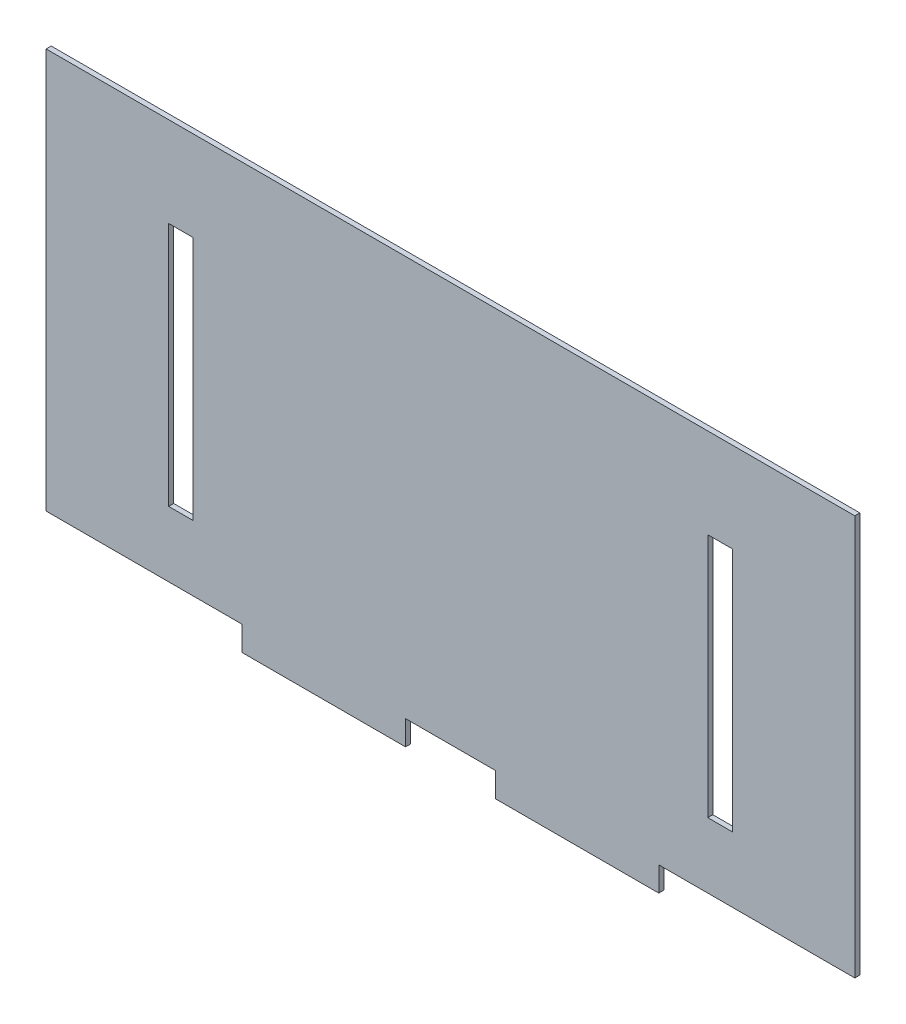
ISO-10303-21;
HEADER;
FILE_DESCRIPTION(('STEP AP214'),'2;1');
FILE_NAME('part.step','',(''),(''),'','','');
FILE_SCHEMA(('AUTOMOTIVE_DESIGN { 1 0 10303 214 1 1 1 1 }'));
ENDSEC;
DATA;
#1=APPLICATION_CONTEXT('core data for automotive mechanical design processes');
#2=APPLICATION_PROTOCOL_DEFINITION('international standard','automotive_design',2000,#1);
#3=PRODUCT_CONTEXT('',#1,'mechanical');
#4=PRODUCT('Part','Part','',(#3));
#5=PRODUCT_RELATED_PRODUCT_CATEGORY('part','',(#4));
#6=PRODUCT_DEFINITION_FORMATION('','',#4);
#7=PRODUCT_DEFINITION_CONTEXT('part definition',#1,'design');
#8=PRODUCT_DEFINITION('design','',#6,#7);
#9=PRODUCT_DEFINITION_SHAPE('','',#8);
#10=(LENGTH_UNIT() NAMED_UNIT(*) SI_UNIT(.MILLI.,.METRE.));
#11=(NAMED_UNIT(*) PLANE_ANGLE_UNIT() SI_UNIT($,.RADIAN.));
#12=(NAMED_UNIT(*) SI_UNIT($,.STERADIAN.) SOLID_ANGLE_UNIT());
#13=UNCERTAINTY_MEASURE_WITH_UNIT(LENGTH_MEASURE(1.E-05),#10,'distance_accuracy_value','');
#14=(GEOMETRIC_REPRESENTATION_CONTEXT(3) GLOBAL_UNCERTAINTY_ASSIGNED_CONTEXT((#13)) GLOBAL_UNIT_ASSIGNED_CONTEXT((#10,
#11,#12)) REPRESENTATION_CONTEXT('',''));
#15=CARTESIAN_POINT('',(0.,0.,0.));
#16=DIRECTION('',(0.,0.,1.));
#17=DIRECTION('',(1.,0.,0.));
#18=AXIS2_PLACEMENT_3D('',#15,#16,#17);
#19=CARTESIAN_POINT('',(0.,0.,3.));
#20=DIRECTION('',(0.,0.,-1.));
#21=DIRECTION('',(-1.,0.,0.));
#22=AXIS2_PLACEMENT_3D('',#19,#20,#21);
#23=PLANE('',#22);
#24=DIRECTION('',(0.,-1.,0.));
#25=VECTOR('',#24,1.);
#26=CARTESIAN_POINT('',(402.597909756795,1127.38171994128,3.));
#27=LINE('',#26,#25);
#28=CARTESIAN_POINT('',(402.597909756795,1272.58049934139,3.));
#29=VERTEX_POINT('',#28);
#30=CARTESIAN_POINT('',(402.597909756795,1127.38171994128,3.));
#31=VERTEX_POINT('',#30);
#32=EDGE_CURVE('E206',#29,#31,#27,.T.);
#33=ORIENTED_EDGE('',*,*,#32,.F.);
#34=DIRECTION('',(-1.,0.,0.));
#35=VECTOR('',#34,1.);
#36=CARTESIAN_POINT('',(402.597909756795,1272.58049934139,3.));
#37=LINE('',#36,#35);
#38=CARTESIAN_POINT('',(417.122789951493,1272.58049934139,3.));
#39=VERTEX_POINT('',#38);
#40=EDGE_CURVE('E214',#39,#29,#37,.T.);
#41=ORIENTED_EDGE('',*,*,#40,.F.);
#42=DIRECTION('',(0.,1.,0.));
#43=VECTOR('',#42,1.);
#44=CARTESIAN_POINT('',(417.122789951493,1272.58049934139,3.));
#45=LINE('',#44,#43);
#46=CARTESIAN_POINT('',(417.122789951493,1127.38171994128,3.));
#47=VERTEX_POINT('',#46);
#48=EDGE_CURVE('E211',#47,#39,#45,.T.);
#49=ORIENTED_EDGE('',*,*,#48,.F.);
#50=DIRECTION('',(1.,0.,0.));
#51=VECTOR('',#50,1.);
#52=CARTESIAN_POINT('',(417.122789951493,1127.38171994128,3.));
#53=LINE('',#52,#51);
#54=EDGE_CURVE('E208',#31,#47,#53,.T.);
#55=ORIENTED_EDGE('',*,*,#54,.F.);
#56=EDGE_LOOP('',(#33,#41,#49,#55));
#57=FACE_BOUND('',#56,.T.);
#58=DIRECTION('',(0.,1.,0.));
#59=VECTOR('',#58,1.);
#60=CARTESIAN_POINT('',(489.722179651545,1325.81949598202,3.));
#61=LINE('',#60,#59);
#62=CARTESIAN_POINT('',(489.722179651545,1088.66927091358,3.));
#63=VERTEX_POINT('',#62);
#64=CARTESIAN_POINT('',(489.722179651545,1325.81949598202,3.));
#65=VERTEX_POINT('',#64);
#66=EDGE_CURVE('E237',#63,#65,#61,.T.);
#67=ORIENTED_EDGE('',*,*,#66,.T.);
#68=DIRECTION('',(-1.,0.,0.));
#69=VECTOR('',#68,1.);
#70=CARTESIAN_POINT('',(10.5628727947426,1325.81949598202,3.));
#71=LINE('',#70,#69);
#72=CARTESIAN_POINT('',(10.5628727947426,1325.81949598202,3.));
#73=VERTEX_POINT('',#72);
#74=EDGE_CURVE('E240',#65,#73,#71,.T.);
#75=ORIENTED_EDGE('',*,*,#74,.T.);
#76=DIRECTION('',(0.,-1.,0.));
#77=VECTOR('',#76,1.);
#78=CARTESIAN_POINT('',(10.5628727947426,1088.66927091358,3.));
#79=LINE('',#78,#77);
#80=CARTESIAN_POINT('',(10.5628727947426,1088.66927091358,3.));
#81=VERTEX_POINT('',#80);
#82=EDGE_CURVE('E243',#73,#81,#79,.T.);
#83=ORIENTED_EDGE('',*,*,#82,.T.);
#84=DIRECTION('',(1.,0.,0.));
#85=VECTOR('',#84,1.);
#86=CARTESIAN_POINT('',(126.721896314826,1088.66927091358,3.));
#87=LINE('',#86,#85);
#88=CARTESIAN_POINT('',(126.721896314826,1088.66927091358,3.));
#89=VERTEX_POINT('',#88);
#90=EDGE_CURVE('E245',#81,#89,#87,.T.);
#91=ORIENTED_EDGE('',*,*,#90,.T.);
#92=DIRECTION('',(0.,-1.,0.));
#93=VECTOR('',#92,1.);
#94=CARTESIAN_POINT('',(126.721896314826,1074.14939297357,3.));
#95=LINE('',#94,#93);
#96=CARTESIAN_POINT('',(126.721896314826,1074.14939297357,3.));
#97=VERTEX_POINT('',#96);
#98=EDGE_CURVE('E247',#89,#97,#95,.T.);
#99=ORIENTED_EDGE('',*,*,#98,.T.);
#100=DIRECTION('',(1.,0.,0.));
#101=VECTOR('',#100,1.);
#102=CARTESIAN_POINT('',(223.522194193715,1074.14939297357,3.));
#103=LINE('',#102,#101);
#104=CARTESIAN_POINT('',(223.522194193715,1074.14939297357,3.));
#105=VERTEX_POINT('',#104);
#106=EDGE_CURVE('E249',#97,#105,#103,.T.);
#107=ORIENTED_EDGE('',*,*,#106,.T.);
#108=DIRECTION('',(0.,1.,0.));
#109=VECTOR('',#108,1.);
#110=CARTESIAN_POINT('',(223.522194193715,1088.66927091358,3.));
#111=LINE('',#110,#109);
#112=CARTESIAN_POINT('',(223.522194193715,1088.66927091358,3.));
#113=VERTEX_POINT('',#112);
#114=EDGE_CURVE('E251',#105,#113,#111,.T.);
#115=ORIENTED_EDGE('',*,*,#114,.T.);
#116=DIRECTION('',(1.,0.,0.));
#117=VECTOR('',#116,1.);
#118=CARTESIAN_POINT('',(276.759523416114,1088.66927091358,3.));
#119=LINE('',#118,#117);
#120=CARTESIAN_POINT('',(276.759523416114,1088.66927091358,3.));
#121=VERTEX_POINT('',#120);
#122=EDGE_CURVE('E253',#113,#121,#119,.T.);
#123=ORIENTED_EDGE('',*,*,#122,.T.);
#124=DIRECTION('',(0.,-1.,0.));
#125=VECTOR('',#124,1.);
#126=CARTESIAN_POINT('',(276.759523416114,1074.14939297357,3.));
#127=LINE('',#126,#125);
#128=CARTESIAN_POINT('',(276.759523416114,1074.14939297357,3.));
#129=VERTEX_POINT('',#128);
#130=EDGE_CURVE('E255',#121,#129,#127,.T.);
#131=ORIENTED_EDGE('',*,*,#130,.T.);
#132=DIRECTION('',(1.,0.,0.));
#133=VECTOR('',#132,1.);
#134=CARTESIAN_POINT('',(373.559821295004,1074.14939297357,3.));
#135=LINE('',#134,#133);
#136=CARTESIAN_POINT('',(373.559821295004,1074.14939297357,3.));
#137=VERTEX_POINT('',#136);
#138=EDGE_CURVE('E257',#129,#137,#135,.T.);
#139=ORIENTED_EDGE('',*,*,#138,.T.);
#140=DIRECTION('',(0.,1.,0.));
#141=VECTOR('',#140,1.);
#142=CARTESIAN_POINT('',(373.559821295004,1088.66927091358,3.));
#143=LINE('',#142,#141);
#144=CARTESIAN_POINT('',(373.559821295004,1088.66927091358,3.));
#145=VERTEX_POINT('',#144);
#146=EDGE_CURVE('E259',#137,#145,#143,.T.);
#147=ORIENTED_EDGE('',*,*,#146,.T.);
#148=DIRECTION('',(1.,0.,0.));
#149=VECTOR('',#148,1.);
#150=CARTESIAN_POINT('',(489.722179651545,1088.66927091358,3.));
#151=LINE('',#150,#149);
#152=EDGE_CURVE('E261',#145,#63,#151,.T.);
#153=ORIENTED_EDGE('',*,*,#152,.T.);
#154=EDGE_LOOP('',(#67,#75,#83,#91,#99,#107,#115,#123,#131,#139,#147,#153));
#155=FACE_BOUND('',#154,.T.);
#156=DIRECTION('',(0.,-1.,0.));
#157=VECTOR('',#156,1.);
#158=CARTESIAN_POINT('',(83.1605950765656,1127.38171994128,3.));
#159=LINE('',#158,#157);
#160=CARTESIAN_POINT('',(83.1605950765656,1272.58049934139,3.));
#161=VERTEX_POINT('',#160);
#162=CARTESIAN_POINT('',(83.1605950765656,1127.38171994128,3.));
#163=VERTEX_POINT('',#162);
#164=EDGE_CURVE('E170',#161,#163,#159,.T.);
#165=ORIENTED_EDGE('',*,*,#164,.F.);
#166=DIRECTION('',(-1.,0.,0.));
#167=VECTOR('',#166,1.);
#168=CARTESIAN_POINT('',(83.1605950765656,1272.58049934139,3.));
#169=LINE('',#168,#167);
#170=CARTESIAN_POINT('',(97.6838078530344,1272.58049934139,3.));
#171=VERTEX_POINT('',#170);
#172=EDGE_CURVE('E192',#171,#161,#169,.T.);
#173=ORIENTED_EDGE('',*,*,#172,.F.);
#174=DIRECTION('',(0.,1.,0.));
#175=VECTOR('',#174,1.);
#176=CARTESIAN_POINT('',(97.6838078530344,1272.58049934139,3.));
#177=LINE('',#176,#175);
#178=CARTESIAN_POINT('',(97.6838078530344,1127.38171994128,3.));
#179=VERTEX_POINT('',#178);
#180=EDGE_CURVE('E190',#179,#171,#177,.T.);
#181=ORIENTED_EDGE('',*,*,#180,.F.);
#182=DIRECTION('',(1.,0.,0.));
#183=VECTOR('',#182,1.);
#184=CARTESIAN_POINT('',(97.6838078530344,1127.38171994128,3.));
#185=LINE('',#184,#183);
#186=EDGE_CURVE('E178',#163,#179,#185,.T.);
#187=ORIENTED_EDGE('',*,*,#186,.F.);
#188=EDGE_LOOP('',(#165,#173,#181,#187));
#189=FACE_BOUND('',#188,.T.);
#190=ADVANCED_FACE('F33',(#57,#155,#189),#23,.F.);
#191=CARTESIAN_POINT('',(0.,0.,0.));
#192=DIRECTION('',(0.,0.,-1.));
#193=DIRECTION('',(-1.,0.,0.));
#194=AXIS2_PLACEMENT_3D('',#191,#192,#193);
#195=PLANE('',#194);
#196=DIRECTION('',(0.,1.,0.));
#197=VECTOR('',#196,1.);
#198=CARTESIAN_POINT('',(489.722179651545,1325.81949598202,0.));
#199=LINE('',#198,#197);
#200=CARTESIAN_POINT('',(489.722179651545,1088.66927091358,0.));
#201=VERTEX_POINT('',#200);
#202=CARTESIAN_POINT('',(489.722179651545,1325.81949598202,0.));
#203=VERTEX_POINT('',#202);
#204=EDGE_CURVE('E236',#201,#203,#199,.T.);
#205=ORIENTED_EDGE('',*,*,#204,.F.);
#206=DIRECTION('',(1.,0.,0.));
#207=VECTOR('',#206,1.);
#208=CARTESIAN_POINT('',(489.722179651545,1088.66927091358,0.));
#209=LINE('',#208,#207);
#210=CARTESIAN_POINT('',(373.559821295004,1088.66927091358,0.));
#211=VERTEX_POINT('',#210);
#212=EDGE_CURVE('E241',#211,#201,#209,.T.);
#213=ORIENTED_EDGE('',*,*,#212,.F.);
#214=DIRECTION('',(0.,1.,0.));
#215=VECTOR('',#214,1.);
#216=CARTESIAN_POINT('',(373.559821295004,1088.66927091358,0.));
#217=LINE('',#216,#215);
#218=CARTESIAN_POINT('',(373.559821295004,1074.14939297357,0.));
#219=VERTEX_POINT('',#218);
#220=EDGE_CURVE('E284',#219,#211,#217,.T.);
#221=ORIENTED_EDGE('',*,*,#220,.F.);
#222=DIRECTION('',(1.,0.,0.));
#223=VECTOR('',#222,1.);
#224=CARTESIAN_POINT('',(373.559821295004,1074.14939297357,0.));
#225=LINE('',#224,#223);
#226=CARTESIAN_POINT('',(276.759523416114,1074.14939297357,0.));
#227=VERTEX_POINT('',#226);
#228=EDGE_CURVE('E282',#227,#219,#225,.T.);
#229=ORIENTED_EDGE('',*,*,#228,.F.);
#230=DIRECTION('',(0.,-1.,0.));
#231=VECTOR('',#230,1.);
#232=CARTESIAN_POINT('',(276.759523416114,1074.14939297357,0.));
#233=LINE('',#232,#231);
#234=CARTESIAN_POINT('',(276.759523416114,1088.66927091358,0.));
#235=VERTEX_POINT('',#234);
#236=EDGE_CURVE('E280',#235,#227,#233,.T.);
#237=ORIENTED_EDGE('',*,*,#236,.F.);
#238=DIRECTION('',(1.,0.,0.));
#239=VECTOR('',#238,1.);
#240=CARTESIAN_POINT('',(276.759523416114,1088.66927091358,0.));
#241=LINE('',#240,#239);
#242=CARTESIAN_POINT('',(223.522194193715,1088.66927091358,0.));
#243=VERTEX_POINT('',#242);
#244=EDGE_CURVE('E278',#243,#235,#241,.T.);
#245=ORIENTED_EDGE('',*,*,#244,.F.);
#246=DIRECTION('',(0.,1.,0.));
#247=VECTOR('',#246,1.);
#248=CARTESIAN_POINT('',(223.522194193715,1088.66927091358,0.));
#249=LINE('',#248,#247);
#250=CARTESIAN_POINT('',(223.522194193715,1074.14939297357,0.));
#251=VERTEX_POINT('',#250);
#252=EDGE_CURVE('E276',#251,#243,#249,.T.);
#253=ORIENTED_EDGE('',*,*,#252,.F.);
#254=DIRECTION('',(1.,0.,0.));
#255=VECTOR('',#254,1.);
#256=CARTESIAN_POINT('',(223.522194193715,1074.14939297357,0.));
#257=LINE('',#256,#255);
#258=CARTESIAN_POINT('',(126.721896314826,1074.14939297357,0.));
#259=VERTEX_POINT('',#258);
#260=EDGE_CURVE('E274',#259,#251,#257,.T.);
#261=ORIENTED_EDGE('',*,*,#260,.F.);
#262=DIRECTION('',(0.,-1.,0.));
#263=VECTOR('',#262,1.);
#264=CARTESIAN_POINT('',(126.721896314826,1074.14939297357,0.));
#265=LINE('',#264,#263);
#266=CARTESIAN_POINT('',(126.721896314826,1088.66927091358,0.));
#267=VERTEX_POINT('',#266);
#268=EDGE_CURVE('E272',#267,#259,#265,.T.);
#269=ORIENTED_EDGE('',*,*,#268,.F.);
#270=DIRECTION('',(1.,0.,0.));
#271=VECTOR('',#270,1.);
#272=CARTESIAN_POINT('',(126.721896314826,1088.66927091358,0.));
#273=LINE('',#272,#271);
#274=CARTESIAN_POINT('',(10.5628727947426,1088.66927091358,0.));
#275=VERTEX_POINT('',#274);
#276=EDGE_CURVE('E270',#275,#267,#273,.T.);
#277=ORIENTED_EDGE('',*,*,#276,.F.);
#278=DIRECTION('',(0.,-1.,0.));
#279=VECTOR('',#278,1.);
#280=CARTESIAN_POINT('',(10.5628727947426,1088.66927091358,0.));
#281=LINE('',#280,#279);
#282=CARTESIAN_POINT('',(10.5628727947426,1325.81949598202,0.));
#283=VERTEX_POINT('',#282);
#284=EDGE_CURVE('E268',#283,#275,#281,.T.);
#285=ORIENTED_EDGE('',*,*,#284,.F.);
#286=DIRECTION('',(-1.,0.,0.));
#287=VECTOR('',#286,1.);
#288=CARTESIAN_POINT('',(10.5628727947426,1325.81949598202,0.));
#289=LINE('',#288,#287);
#290=EDGE_CURVE('E266',#203,#283,#289,.T.);
#291=ORIENTED_EDGE('',*,*,#290,.F.);
#292=EDGE_LOOP('',(#205,#213,#221,#229,#237,#245,#253,#261,#269,#277,#285,#291));
#293=FACE_BOUND('',#292,.T.);
#294=DIRECTION('',(-1.,0.,0.));
#295=VECTOR('',#294,1.);
#296=CARTESIAN_POINT('',(402.597909756795,1272.58049934139,0.));
#297=LINE('',#296,#295);
#298=CARTESIAN_POINT('',(417.122789951493,1272.58049934139,0.));
#299=VERTEX_POINT('',#298);
#300=CARTESIAN_POINT('',(402.597909756795,1272.58049934139,0.));
#301=VERTEX_POINT('',#300);
#302=EDGE_CURVE('E209',#299,#301,#297,.T.);
#303=ORIENTED_EDGE('',*,*,#302,.T.);
#304=DIRECTION('',(0.,-1.,0.));
#305=VECTOR('',#304,1.);
#306=CARTESIAN_POINT('',(402.597909756795,1127.38171994128,0.));
#307=LINE('',#306,#305);
#308=CARTESIAN_POINT('',(402.597909756795,1127.38171994128,0.));
#309=VERTEX_POINT('',#308);
#310=EDGE_CURVE('E186',#301,#309,#307,.T.);
#311=ORIENTED_EDGE('',*,*,#310,.T.);
#312=DIRECTION('',(1.,0.,0.));
#313=VECTOR('',#312,1.);
#314=CARTESIAN_POINT('',(417.122789951493,1127.38171994128,0.));
#315=LINE('',#314,#313);
#316=CARTESIAN_POINT('',(417.122789951493,1127.38171994128,0.));
#317=VERTEX_POINT('',#316);
#318=EDGE_CURVE('E219',#309,#317,#315,.T.);
#319=ORIENTED_EDGE('',*,*,#318,.T.);
#320=DIRECTION('',(0.,1.,0.));
#321=VECTOR('',#320,1.);
#322=CARTESIAN_POINT('',(417.122789951493,1272.58049934139,0.));
#323=LINE('',#322,#321);
#324=EDGE_CURVE('E222',#317,#299,#323,.T.);
#325=ORIENTED_EDGE('',*,*,#324,.T.);
#326=EDGE_LOOP('',(#303,#311,#319,#325));
#327=FACE_BOUND('',#326,.T.);
#328=DIRECTION('',(-1.,0.,0.));
#329=VECTOR('',#328,1.);
#330=CARTESIAN_POINT('',(83.1605950765656,1272.58049934139,0.));
#331=LINE('',#330,#329);
#332=CARTESIAN_POINT('',(97.6838078530344,1272.58049934139,0.));
#333=VERTEX_POINT('',#332);
#334=CARTESIAN_POINT('',(83.1605950765656,1272.58049934139,0.));
#335=VERTEX_POINT('',#334);
#336=EDGE_CURVE('E179',#333,#335,#331,.T.);
#337=ORIENTED_EDGE('',*,*,#336,.T.);
#338=DIRECTION('',(0.,-1.,0.));
#339=VECTOR('',#338,1.);
#340=CARTESIAN_POINT('',(83.1605950765656,1127.38171994128,0.));
#341=LINE('',#340,#339);
#342=CARTESIAN_POINT('',(83.1605950765656,1127.38171994128,0.));
#343=VERTEX_POINT('',#342);
#344=EDGE_CURVE('E56',#335,#343,#341,.T.);
#345=ORIENTED_EDGE('',*,*,#344,.T.);
#346=DIRECTION('',(1.,0.,0.));
#347=VECTOR('',#346,1.);
#348=CARTESIAN_POINT('',(97.6838078530344,1127.38171994128,0.));
#349=LINE('',#348,#347);
#350=CARTESIAN_POINT('',(97.6838078530344,1127.38171994128,0.));
#351=VERTEX_POINT('',#350);
#352=EDGE_CURVE('E185',#343,#351,#349,.T.);
#353=ORIENTED_EDGE('',*,*,#352,.T.);
#354=DIRECTION('',(0.,1.,0.));
#355=VECTOR('',#354,1.);
#356=CARTESIAN_POINT('',(97.6838078530344,1272.58049934139,0.));
#357=LINE('',#356,#355);
#358=EDGE_CURVE('E198',#351,#333,#357,.T.);
#359=ORIENTED_EDGE('',*,*,#358,.T.);
#360=EDGE_LOOP('',(#337,#345,#353,#359));
#361=FACE_BOUND('',#360,.T.);
#362=ADVANCED_FACE('F326',(#293,#327,#361),#195,.T.);
#363=CARTESIAN_POINT('',(489.722179651545,1325.81949598202,3.));
#364=DIRECTION('',(-1.,0.,0.));
#365=DIRECTION('',(0.,0.,1.));
#366=AXIS2_PLACEMENT_3D('',#363,#364,#365);
#367=PLANE('',#366);
#368=ORIENTED_EDGE('',*,*,#204,.T.);
#369=DIRECTION('',(0.,0.,-1.));
#370=VECTOR('',#369,1.);
#371=CARTESIAN_POINT('',(489.722179651545,1325.81949598202,3.));
#372=LINE('',#371,#370);
#373=EDGE_CURVE('E11',#65,#203,#372,.T.);
#374=ORIENTED_EDGE('',*,*,#373,.F.);
#375=ORIENTED_EDGE('',*,*,#66,.F.);
#376=DIRECTION('',(0.,0.,-1.));
#377=VECTOR('',#376,1.);
#378=CARTESIAN_POINT('',(489.722179651545,1088.66927091358,3.));
#379=LINE('',#378,#377);
#380=EDGE_CURVE('E263',#63,#201,#379,.T.);
#381=ORIENTED_EDGE('',*,*,#380,.T.);
#382=EDGE_LOOP('',(#368,#374,#375,#381));
#383=FACE_BOUND('',#382,.T.);
#384=ADVANCED_FACE('F35',(#383),#367,.F.);
#385=CARTESIAN_POINT('',(10.5628727947426,1325.81949598202,3.));
#386=DIRECTION('',(0.,-1.,0.));
#387=DIRECTION('',(0.,0.,-1.));
#388=AXIS2_PLACEMENT_3D('',#385,#386,#387);
#389=PLANE('',#388);
#390=ORIENTED_EDGE('',*,*,#290,.T.);
#391=DIRECTION('',(0.,0.,-1.));
#392=VECTOR('',#391,1.);
#393=CARTESIAN_POINT('',(10.5628727947426,1325.81949598202,3.));
#394=LINE('',#393,#392);
#395=EDGE_CURVE('E41',#73,#283,#394,.T.);
#396=ORIENTED_EDGE('',*,*,#395,.F.);
#397=ORIENTED_EDGE('',*,*,#74,.F.);
#398=ORIENTED_EDGE('',*,*,#373,.T.);
#399=EDGE_LOOP('',(#390,#396,#397,#398));
#400=FACE_BOUND('',#399,.T.);
#401=ADVANCED_FACE('F343',(#400),#389,.F.);
#402=CARTESIAN_POINT('',(10.5628727947426,1088.66927091358,3.));
#403=DIRECTION('',(1.,0.,0.));
#404=DIRECTION('',(0.,0.,-1.));
#405=AXIS2_PLACEMENT_3D('',#402,#403,#404);
#406=PLANE('',#405);
#407=ORIENTED_EDGE('',*,*,#284,.T.);
#408=DIRECTION('',(0.,0.,-1.));
#409=VECTOR('',#408,1.);
#410=CARTESIAN_POINT('',(10.5628727947426,1088.66927091358,3.));
#411=LINE('',#410,#409);
#412=EDGE_CURVE('E313',#81,#275,#411,.T.);
#413=ORIENTED_EDGE('',*,*,#412,.F.);
#414=ORIENTED_EDGE('',*,*,#82,.F.);
#415=ORIENTED_EDGE('',*,*,#395,.T.);
#416=EDGE_LOOP('',(#407,#413,#414,#415));
#417=FACE_BOUND('',#416,.T.);
#418=ADVANCED_FACE('F320',(#417),#406,.F.);
#419=CARTESIAN_POINT('',(126.721896314826,1088.66927091358,3.));
#420=DIRECTION('',(0.,1.,0.));
#421=DIRECTION('',(0.,0.,1.));
#422=AXIS2_PLACEMENT_3D('',#419,#420,#421);
#423=PLANE('',#422);
#424=ORIENTED_EDGE('',*,*,#276,.T.);
#425=DIRECTION('',(0.,0.,-1.));
#426=VECTOR('',#425,1.);
#427=CARTESIAN_POINT('',(126.721896314826,1088.66927091358,3.));
#428=LINE('',#427,#426);
#429=EDGE_CURVE('E310',#89,#267,#428,.T.);
#430=ORIENTED_EDGE('',*,*,#429,.F.);
#431=ORIENTED_EDGE('',*,*,#90,.F.);
#432=ORIENTED_EDGE('',*,*,#412,.T.);
#433=EDGE_LOOP('',(#424,#430,#431,#432));
#434=FACE_BOUND('',#433,.T.);
#435=ADVANCED_FACE('F332',(#434),#423,.F.);
#436=CARTESIAN_POINT('',(126.721896314826,1074.14939297357,3.));
#437=DIRECTION('',(1.,0.,0.));
#438=DIRECTION('',(0.,0.,-1.));
#439=AXIS2_PLACEMENT_3D('',#436,#437,#438);
#440=PLANE('',#439);
#441=ORIENTED_EDGE('',*,*,#268,.T.);
#442=DIRECTION('',(0.,0.,-1.));
#443=VECTOR('',#442,1.);
#444=CARTESIAN_POINT('',(126.721896314826,1074.14939297357,3.));
#445=LINE('',#444,#443);
#446=EDGE_CURVE('E307',#97,#259,#445,.T.);
#447=ORIENTED_EDGE('',*,*,#446,.F.);
#448=ORIENTED_EDGE('',*,*,#98,.F.);
#449=ORIENTED_EDGE('',*,*,#429,.T.);
#450=EDGE_LOOP('',(#441,#447,#448,#449));
#451=FACE_BOUND('',#450,.T.);
#452=ADVANCED_FACE('F336',(#451),#440,.F.);
#453=CARTESIAN_POINT('',(223.522194193715,1074.14939297357,3.));
#454=DIRECTION('',(0.,1.,0.));
#455=DIRECTION('',(0.,0.,1.));
#456=AXIS2_PLACEMENT_3D('',#453,#454,#455);
#457=PLANE('',#456);
#458=ORIENTED_EDGE('',*,*,#260,.T.);
#459=DIRECTION('',(0.,0.,-1.));
#460=VECTOR('',#459,1.);
#461=CARTESIAN_POINT('',(223.522194193715,1074.14939297357,3.));
#462=LINE('',#461,#460);
#463=EDGE_CURVE('E304',#105,#251,#462,.T.);
#464=ORIENTED_EDGE('',*,*,#463,.F.);
#465=ORIENTED_EDGE('',*,*,#106,.F.);
#466=ORIENTED_EDGE('',*,*,#446,.T.);
#467=EDGE_LOOP('',(#458,#464,#465,#466));
#468=FACE_BOUND('',#467,.T.);
#469=ADVANCED_FACE('F376',(#468),#457,.F.);
#470=CARTESIAN_POINT('',(223.522194193715,1088.66927091358,3.));
#471=DIRECTION('',(-1.,0.,0.));
#472=DIRECTION('',(0.,0.,1.));
#473=AXIS2_PLACEMENT_3D('',#470,#471,#472);
#474=PLANE('',#473);
#475=ORIENTED_EDGE('',*,*,#252,.T.);
#476=DIRECTION('',(0.,0.,-1.));
#477=VECTOR('',#476,1.);
#478=CARTESIAN_POINT('',(223.522194193715,1088.66927091358,3.));
#479=LINE('',#478,#477);
#480=EDGE_CURVE('E301',#113,#243,#479,.T.);
#481=ORIENTED_EDGE('',*,*,#480,.F.);
#482=ORIENTED_EDGE('',*,*,#114,.F.);
#483=ORIENTED_EDGE('',*,*,#463,.T.);
#484=EDGE_LOOP('',(#475,#481,#482,#483));
#485=FACE_BOUND('',#484,.T.);
#486=ADVANCED_FACE('F374',(#485),#474,.F.);
#487=CARTESIAN_POINT('',(276.759523416114,1088.66927091358,3.));
#488=DIRECTION('',(0.,1.,0.));
#489=DIRECTION('',(0.,0.,1.));
#490=AXIS2_PLACEMENT_3D('',#487,#488,#489);
#491=PLANE('',#490);
#492=ORIENTED_EDGE('',*,*,#244,.T.);
#493=DIRECTION('',(0.,0.,-1.));
#494=VECTOR('',#493,1.);
#495=CARTESIAN_POINT('',(276.759523416114,1088.66927091358,3.));
#496=LINE('',#495,#494);
#497=EDGE_CURVE('E298',#121,#235,#496,.T.);
#498=ORIENTED_EDGE('',*,*,#497,.F.);
#499=ORIENTED_EDGE('',*,*,#122,.F.);
#500=ORIENTED_EDGE('',*,*,#480,.T.);
#501=EDGE_LOOP('',(#492,#498,#499,#500));
#502=FACE_BOUND('',#501,.T.);
#503=ADVANCED_FACE('F370',(#502),#491,.F.);
#504=CARTESIAN_POINT('',(276.759523416114,1074.14939297357,3.));
#505=DIRECTION('',(1.,0.,0.));
#506=DIRECTION('',(0.,0.,-1.));
#507=AXIS2_PLACEMENT_3D('',#504,#505,#506);
#508=PLANE('',#507);
#509=ORIENTED_EDGE('',*,*,#236,.T.);
#510=DIRECTION('',(0.,0.,-1.));
#511=VECTOR('',#510,1.);
#512=CARTESIAN_POINT('',(276.759523416114,1074.14939297357,3.));
#513=LINE('',#512,#511);
#514=EDGE_CURVE('E295',#129,#227,#513,.T.);
#515=ORIENTED_EDGE('',*,*,#514,.F.);
#516=ORIENTED_EDGE('',*,*,#130,.F.);
#517=ORIENTED_EDGE('',*,*,#497,.T.);
#518=EDGE_LOOP('',(#509,#515,#516,#517));
#519=FACE_BOUND('',#518,.T.);
#520=ADVANCED_FACE('F365',(#519),#508,.F.);
#521=CARTESIAN_POINT('',(373.559821295004,1074.14939297357,3.));
#522=DIRECTION('',(0.,1.,0.));
#523=DIRECTION('',(0.,0.,1.));
#524=AXIS2_PLACEMENT_3D('',#521,#522,#523);
#525=PLANE('',#524);
#526=ORIENTED_EDGE('',*,*,#228,.T.);
#527=DIRECTION('',(0.,0.,-1.));
#528=VECTOR('',#527,1.);
#529=CARTESIAN_POINT('',(373.559821295004,1074.14939297357,3.));
#530=LINE('',#529,#528);
#531=EDGE_CURVE('E292',#137,#219,#530,.T.);
#532=ORIENTED_EDGE('',*,*,#531,.F.);
#533=ORIENTED_EDGE('',*,*,#138,.F.);
#534=ORIENTED_EDGE('',*,*,#514,.T.);
#535=EDGE_LOOP('',(#526,#532,#533,#534));
#536=FACE_BOUND('',#535,.T.);
#537=ADVANCED_FACE('F359',(#536),#525,.F.);
#538=CARTESIAN_POINT('',(373.559821295004,1088.66927091358,3.));
#539=DIRECTION('',(-1.,0.,0.));
#540=DIRECTION('',(0.,0.,1.));
#541=AXIS2_PLACEMENT_3D('',#538,#539,#540);
#542=PLANE('',#541);
#543=ORIENTED_EDGE('',*,*,#220,.T.);
#544=DIRECTION('',(0.,0.,-1.));
#545=VECTOR('',#544,1.);
#546=CARTESIAN_POINT('',(373.559821295004,1088.66927091358,3.));
#547=LINE('',#546,#545);
#548=EDGE_CURVE('E289',#145,#211,#547,.T.);
#549=ORIENTED_EDGE('',*,*,#548,.F.);
#550=ORIENTED_EDGE('',*,*,#146,.F.);
#551=ORIENTED_EDGE('',*,*,#531,.T.);
#552=EDGE_LOOP('',(#543,#549,#550,#551));
#553=FACE_BOUND('',#552,.T.);
#554=ADVANCED_FACE('F355',(#553),#542,.F.);
#555=CARTESIAN_POINT('',(489.722179651545,1088.66927091358,3.));
#556=DIRECTION('',(0.,1.,0.));
#557=DIRECTION('',(0.,0.,1.));
#558=AXIS2_PLACEMENT_3D('',#555,#556,#557);
#559=PLANE('',#558);
#560=ORIENTED_EDGE('',*,*,#212,.T.);
#561=ORIENTED_EDGE('',*,*,#380,.F.);
#562=ORIENTED_EDGE('',*,*,#152,.F.);
#563=ORIENTED_EDGE('',*,*,#548,.T.);
#564=EDGE_LOOP('',(#560,#561,#562,#563));
#565=FACE_BOUND('',#564,.T.);
#566=ADVANCED_FACE('F350',(#565),#559,.F.);
#567=CARTESIAN_POINT('',(402.597909756795,1127.38171994128,3.));
#568=DIRECTION('',(1.,0.,0.));
#569=DIRECTION('',(0.,0.,-1.));
#570=AXIS2_PLACEMENT_3D('',#567,#568,#569);
#571=PLANE('',#570);
#572=ORIENTED_EDGE('',*,*,#310,.F.);
#573=DIRECTION('',(0.,0.,-1.));
#574=VECTOR('',#573,1.);
#575=CARTESIAN_POINT('',(402.597909756795,1272.58049934139,3.));
#576=LINE('',#575,#574);
#577=EDGE_CURVE('E216',#29,#301,#576,.T.);
#578=ORIENTED_EDGE('',*,*,#577,.F.);
#579=ORIENTED_EDGE('',*,*,#32,.T.);
#580=DIRECTION('',(0.,0.,-1.));
#581=VECTOR('',#580,1.);
#582=CARTESIAN_POINT('',(402.597909756795,1127.38171994128,3.));
#583=LINE('',#582,#581);
#584=EDGE_CURVE('E233',#31,#309,#583,.T.);
#585=ORIENTED_EDGE('',*,*,#584,.T.);
#586=EDGE_LOOP('',(#572,#578,#579,#585));
#587=FACE_BOUND('',#586,.T.);
#588=ADVANCED_FACE('F394',(#587),#571,.T.);
#589=CARTESIAN_POINT('',(417.122789951493,1127.38171994128,3.));
#590=DIRECTION('',(0.,1.,0.));
#591=DIRECTION('',(0.,0.,1.));
#592=AXIS2_PLACEMENT_3D('',#589,#590,#591);
#593=PLANE('',#592);
#594=ORIENTED_EDGE('',*,*,#318,.F.);
#595=ORIENTED_EDGE('',*,*,#584,.F.);
#596=ORIENTED_EDGE('',*,*,#54,.T.);
#597=DIRECTION('',(0.,0.,-1.));
#598=VECTOR('',#597,1.);
#599=CARTESIAN_POINT('',(417.122789951493,1127.38171994128,3.));
#600=LINE('',#599,#598);
#601=EDGE_CURVE('E231',#47,#317,#600,.T.);
#602=ORIENTED_EDGE('',*,*,#601,.T.);
#603=EDGE_LOOP('',(#594,#595,#596,#602));
#604=FACE_BOUND('',#603,.T.);
#605=ADVANCED_FACE('F432',(#604),#593,.T.);
#606=CARTESIAN_POINT('',(417.122789951493,1272.58049934139,3.));
#607=DIRECTION('',(-1.,0.,0.));
#608=DIRECTION('',(0.,0.,1.));
#609=AXIS2_PLACEMENT_3D('',#606,#607,#608);
#610=PLANE('',#609);
#611=ORIENTED_EDGE('',*,*,#324,.F.);
#612=ORIENTED_EDGE('',*,*,#601,.F.);
#613=ORIENTED_EDGE('',*,*,#48,.T.);
#614=DIRECTION('',(0.,0.,-1.));
#615=VECTOR('',#614,1.);
#616=CARTESIAN_POINT('',(417.122789951493,1272.58049934139,3.));
#617=LINE('',#616,#615);
#618=EDGE_CURVE('E229',#39,#299,#617,.T.);
#619=ORIENTED_EDGE('',*,*,#618,.T.);
#620=EDGE_LOOP('',(#611,#612,#613,#619));
#621=FACE_BOUND('',#620,.T.);
#622=ADVANCED_FACE('F439',(#621),#610,.T.);
#623=CARTESIAN_POINT('',(402.597909756795,1272.58049934139,3.));
#624=DIRECTION('',(0.,-1.,0.));
#625=DIRECTION('',(0.,0.,-1.));
#626=AXIS2_PLACEMENT_3D('',#623,#624,#625);
#627=PLANE('',#626);
#628=ORIENTED_EDGE('',*,*,#302,.F.);
#629=ORIENTED_EDGE('',*,*,#618,.F.);
#630=ORIENTED_EDGE('',*,*,#40,.T.);
#631=ORIENTED_EDGE('',*,*,#577,.T.);
#632=EDGE_LOOP('',(#628,#629,#630,#631));
#633=FACE_BOUND('',#632,.T.);
#634=ADVANCED_FACE('F446',(#633),#627,.T.);
#635=CARTESIAN_POINT('',(83.1605950765656,1127.38171994128,3.));
#636=DIRECTION('',(1.,0.,0.));
#637=DIRECTION('',(0.,0.,-1.));
#638=AXIS2_PLACEMENT_3D('',#635,#636,#637);
#639=PLANE('',#638);
#640=ORIENTED_EDGE('',*,*,#344,.F.);
#641=DIRECTION('',(0.,0.,-1.));
#642=VECTOR('',#641,1.);
#643=CARTESIAN_POINT('',(83.1605950765656,1272.58049934139,3.));
#644=LINE('',#643,#642);
#645=EDGE_CURVE('E174',#161,#335,#644,.T.);
#646=ORIENTED_EDGE('',*,*,#645,.F.);
#647=ORIENTED_EDGE('',*,*,#164,.T.);
#648=DIRECTION('',(0.,0.,-1.));
#649=VECTOR('',#648,1.);
#650=CARTESIAN_POINT('',(83.1605950765656,1127.38171994128,3.));
#651=LINE('',#650,#649);
#652=EDGE_CURVE('E173',#163,#343,#651,.T.);
#653=ORIENTED_EDGE('',*,*,#652,.T.);
#654=EDGE_LOOP('',(#640,#646,#647,#653));
#655=FACE_BOUND('',#654,.T.);
#656=ADVANCED_FACE('F172',(#655),#639,.T.);
#657=CARTESIAN_POINT('',(97.6838078530344,1127.38171994128,3.));
#658=DIRECTION('',(0.,1.,0.));
#659=DIRECTION('',(0.,0.,1.));
#660=AXIS2_PLACEMENT_3D('',#657,#658,#659);
#661=PLANE('',#660);
#662=ORIENTED_EDGE('',*,*,#352,.F.);
#663=ORIENTED_EDGE('',*,*,#652,.F.);
#664=ORIENTED_EDGE('',*,*,#186,.T.);
#665=DIRECTION('',(0.,0.,-1.));
#666=VECTOR('',#665,1.);
#667=CARTESIAN_POINT('',(97.6838078530344,1127.38171994128,3.));
#668=LINE('',#667,#666);
#669=EDGE_CURVE('E187',#179,#351,#668,.T.);
#670=ORIENTED_EDGE('',*,*,#669,.T.);
#671=EDGE_LOOP('',(#662,#663,#664,#670));
#672=FACE_BOUND('',#671,.T.);
#673=ADVANCED_FACE('F182',(#672),#661,.T.);
#674=CARTESIAN_POINT('',(97.6838078530344,1272.58049934139,3.));
#675=DIRECTION('',(-1.,0.,0.));
#676=DIRECTION('',(0.,0.,1.));
#677=AXIS2_PLACEMENT_3D('',#674,#675,#676);
#678=PLANE('',#677);
#679=ORIENTED_EDGE('',*,*,#358,.F.);
#680=ORIENTED_EDGE('',*,*,#669,.F.);
#681=ORIENTED_EDGE('',*,*,#180,.T.);
#682=DIRECTION('',(0.,0.,-1.));
#683=VECTOR('',#682,1.);
#684=CARTESIAN_POINT('',(97.6838078530344,1272.58049934139,3.));
#685=LINE('',#684,#683);
#686=EDGE_CURVE('E48',#171,#333,#685,.T.);
#687=ORIENTED_EDGE('',*,*,#686,.T.);
#688=EDGE_LOOP('',(#679,#680,#681,#687));
#689=FACE_BOUND('',#688,.T.);
#690=ADVANCED_FACE('F467',(#689),#678,.T.);
#691=CARTESIAN_POINT('',(83.1605950765656,1272.58049934139,3.));
#692=DIRECTION('',(0.,-1.,0.));
#693=DIRECTION('',(0.,0.,-1.));
#694=AXIS2_PLACEMENT_3D('',#691,#692,#693);
#695=PLANE('',#694);
#696=ORIENTED_EDGE('',*,*,#336,.F.);
#697=ORIENTED_EDGE('',*,*,#686,.F.);
#698=ORIENTED_EDGE('',*,*,#172,.T.);
#699=ORIENTED_EDGE('',*,*,#645,.T.);
#700=EDGE_LOOP('',(#696,#697,#698,#699));
#701=FACE_BOUND('',#700,.T.);
#702=ADVANCED_FACE('F474',(#701),#695,.T.);
#703=CLOSED_SHELL('',(#190,#362,#384,#401,#418,#435,#452,#469,#486,#503,#520,#537,#554,#566,
#588,#605,#622,#634,#656,#673,#690,#702));
#704=MANIFOLD_SOLID_BREP('B2',#703);
#705=ADVANCED_BREP_SHAPE_REPRESENTATION('',(#18,#704),#14);
#706=SHAPE_DEFINITION_REPRESENTATION(#9,#705);
ENDSEC;
END-ISO-10303-21;
